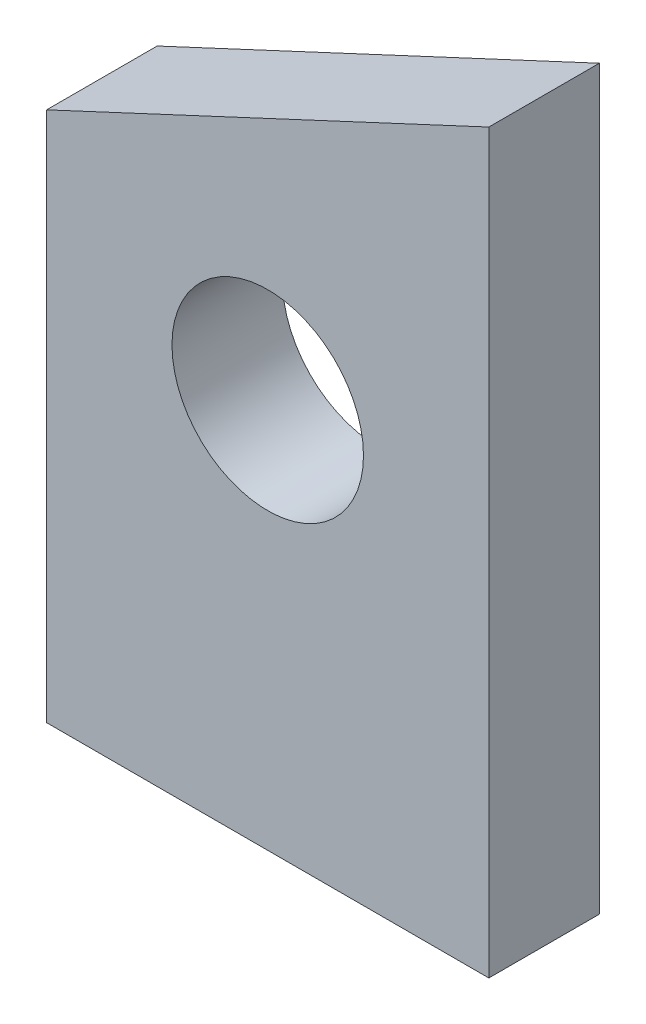
ISO-10303-21;
HEADER;
FILE_DESCRIPTION(('STEP AP214'),'2;1');
FILE_NAME('part.step','',(''),(''),'','','');
FILE_SCHEMA(('AUTOMOTIVE_DESIGN { 1 0 10303 214 1 1 1 1 }'));
ENDSEC;
DATA;
#1=APPLICATION_CONTEXT('core data for automotive mechanical design processes');
#2=APPLICATION_PROTOCOL_DEFINITION('international standard','automotive_design',2000,#1);
#3=PRODUCT_CONTEXT('',#1,'mechanical');
#4=PRODUCT('Part','Part','',(#3));
#5=PRODUCT_RELATED_PRODUCT_CATEGORY('part','',(#4));
#6=PRODUCT_DEFINITION_FORMATION('','',#4);
#7=PRODUCT_DEFINITION_CONTEXT('part definition',#1,'design');
#8=PRODUCT_DEFINITION('design','',#6,#7);
#9=PRODUCT_DEFINITION_SHAPE('','',#8);
#10=(LENGTH_UNIT() NAMED_UNIT(*) SI_UNIT(.MILLI.,.METRE.));
#11=(NAMED_UNIT(*) PLANE_ANGLE_UNIT() SI_UNIT($,.RADIAN.));
#12=(NAMED_UNIT(*) SI_UNIT($,.STERADIAN.) SOLID_ANGLE_UNIT());
#13=UNCERTAINTY_MEASURE_WITH_UNIT(LENGTH_MEASURE(1.E-05),#10,'distance_accuracy_value','');
#14=(GEOMETRIC_REPRESENTATION_CONTEXT(3) GLOBAL_UNCERTAINTY_ASSIGNED_CONTEXT((#13)) GLOBAL_UNIT_ASSIGNED_CONTEXT((#10,
#11,#12)) REPRESENTATION_CONTEXT('',''));
#15=CARTESIAN_POINT('',(0.,0.,0.));
#16=DIRECTION('',(0.,0.,1.));
#17=DIRECTION('',(1.,0.,0.));
#18=AXIS2_PLACEMENT_3D('',#15,#16,#17);
#19=CARTESIAN_POINT('',(0.,63.5,0.));
#20=DIRECTION('',(1.,0.,0.));
#21=DIRECTION('',(0.,0.,-1.));
#22=AXIS2_PLACEMENT_3D('',#19,#20,#21);
#23=PLANE('',#22);
#24=DIRECTION('',(0.,0.,1.));
#25=VECTOR('',#24,1.);
#26=CARTESIAN_POINT('',(0.,15.2426573283484,-0.00100000000000013));
#27=LINE('',#26,#25);
#28=CARTESIAN_POINT('',(0.,15.2426573283484,0.));
#29=VERTEX_POINT('',#28);
#30=CARTESIAN_POINT('',(0.,15.2426573283484,3.175));
#31=VERTEX_POINT('',#30);
#32=EDGE_CURVE('E81',#29,#31,#27,.T.);
#33=ORIENTED_EDGE('',*,*,#32,.F.);
#34=DIRECTION('',(0.,-1.,0.));
#35=VECTOR('',#34,1.);
#36=CARTESIAN_POINT('',(0.,63.5,0.));
#37=LINE('',#36,#35);
#38=CARTESIAN_POINT('',(0.,0.,0.));
#39=VERTEX_POINT('',#38);
#40=EDGE_CURVE('E65',#29,#39,#37,.T.);
#41=ORIENTED_EDGE('',*,*,#40,.T.);
#42=DIRECTION('',(0.,0.,1.));
#43=VECTOR('',#42,1.);
#44=CARTESIAN_POINT('',(0.,0.,0.));
#45=LINE('',#44,#43);
#46=CARTESIAN_POINT('',(0.,0.,3.175));
#47=VERTEX_POINT('',#46);
#48=EDGE_CURVE('E96',#39,#47,#45,.T.);
#49=ORIENTED_EDGE('',*,*,#48,.T.);
#50=DIRECTION('',(0.,-1.,0.));
#51=VECTOR('',#50,1.);
#52=CARTESIAN_POINT('',(0.,63.5,3.175));
#53=LINE('',#52,#51);
#54=EDGE_CURVE('E11',#31,#47,#53,.T.);
#55=ORIENTED_EDGE('',*,*,#54,.F.);
#56=EDGE_LOOP('',(#33,#41,#49,#55));
#57=FACE_BOUND('',#56,.T.);
#58=ADVANCED_FACE('F43',(#57),#23,.F.);
#59=CARTESIAN_POINT('',(0.,63.5,3.175));
#60=DIRECTION('',(0.,0.,-1.));
#61=DIRECTION('',(-1.,0.,0.));
#62=AXIS2_PLACEMENT_3D('',#59,#60,#61);
#63=PLANE('',#62);
#64=DIRECTION('',(-0.906307787036648,-0.422618261740704,0.));
#65=VECTOR('',#64,1.);
#66=CARTESIAN_POINT('',(12.7,21.1647645869169,3.175));
#67=LINE('',#66,#65);
#68=CARTESIAN_POINT('',(12.7,21.1647645869169,3.175));
#69=VERTEX_POINT('',#68);
#70=EDGE_CURVE('E84',#69,#31,#67,.T.);
#71=ORIENTED_EDGE('',*,*,#70,.T.);
#72=ORIENTED_EDGE('',*,*,#54,.T.);
#73=DIRECTION('',(1.,0.,0.));
#74=VECTOR('',#73,1.);
#75=CARTESIAN_POINT('',(0.,0.,3.175));
#76=LINE('',#75,#74);
#77=CARTESIAN_POINT('',(12.7,0.,3.175));
#78=VERTEX_POINT('',#77);
#79=EDGE_CURVE('E99',#47,#78,#76,.T.);
#80=ORIENTED_EDGE('',*,*,#79,.T.);
#81=DIRECTION('',(0.,-1.,0.));
#82=VECTOR('',#81,1.);
#83=CARTESIAN_POINT('',(12.7,63.5,3.175));
#84=LINE('',#83,#82);
#85=EDGE_CURVE('E50',#69,#78,#84,.T.);
#86=ORIENTED_EDGE('',*,*,#85,.F.);
#87=EDGE_LOOP('',(#71,#72,#80,#86));
#88=FACE_BOUND('',#87,.T.);
#89=CARTESIAN_POINT('',(6.35,11.1972611722229,3.175));
#90=DIRECTION('',(0.,0.,-1.));
#91=DIRECTION('',(-1.,0.,0.));
#92=AXIS2_PLACEMENT_3D('',#89,#90,#91);
#93=CIRCLE('',#92,2.75);
#94=CARTESIAN_POINT('',(3.6,11.1972611722229,3.175));
#95=VERTEX_POINT('',#94);
#96=EDGE_CURVE('E100',#95,#95,#93,.T.);
#97=ORIENTED_EDGE('',*,*,#96,.T.);
#98=EDGE_LOOP('',(#97));
#99=FACE_BOUND('',#98,.T.);
#100=ADVANCED_FACE('F90',(#88,#99),#63,.F.);
#101=CARTESIAN_POINT('',(12.7,63.5,0.));
#102=DIRECTION('',(-1.,0.,0.));
#103=DIRECTION('',(0.,0.,1.));
#104=AXIS2_PLACEMENT_3D('',#101,#102,#103);
#105=PLANE('',#104);
#106=DIRECTION('',(0.,0.,1.));
#107=VECTOR('',#106,1.);
#108=CARTESIAN_POINT('',(12.7,21.1647645869169,-0.00100000000000013));
#109=LINE('',#108,#107);
#110=CARTESIAN_POINT('',(12.7,21.1647645869169,0.));
#111=VERTEX_POINT('',#110);
#112=EDGE_CURVE('E57',#111,#69,#109,.T.);
#113=ORIENTED_EDGE('',*,*,#112,.T.);
#114=ORIENTED_EDGE('',*,*,#85,.T.);
#115=DIRECTION('',(0.,0.,-1.));
#116=VECTOR('',#115,1.);
#117=CARTESIAN_POINT('',(12.7,0.,0.));
#118=LINE('',#117,#116);
#119=CARTESIAN_POINT('',(12.7,0.,0.));
#120=VERTEX_POINT('',#119);
#121=EDGE_CURVE('E102',#78,#120,#118,.T.);
#122=ORIENTED_EDGE('',*,*,#121,.T.);
#123=DIRECTION('',(0.,-1.,0.));
#124=VECTOR('',#123,1.);
#125=CARTESIAN_POINT('',(12.7,63.5,0.));
#126=LINE('',#125,#124);
#127=EDGE_CURVE('E114',#111,#120,#126,.T.);
#128=ORIENTED_EDGE('',*,*,#127,.F.);
#129=EDGE_LOOP('',(#113,#114,#122,#128));
#130=FACE_BOUND('',#129,.T.);
#131=ADVANCED_FACE('F116',(#130),#105,.F.);
#132=CARTESIAN_POINT('',(0.,63.5,0.));
#133=DIRECTION('',(0.,0.,1.));
#134=DIRECTION('',(1.,0.,0.));
#135=AXIS2_PLACEMENT_3D('',#132,#133,#134);
#136=PLANE('',#135);
#137=DIRECTION('',(0.906307787036648,0.422618261740704,0.));
#138=VECTOR('',#137,1.);
#139=CARTESIAN_POINT('',(12.7,21.1647645869169,0.));
#140=LINE('',#139,#138);
#141=EDGE_CURVE('E85',#29,#111,#140,.T.);
#142=ORIENTED_EDGE('',*,*,#141,.T.);
#143=ORIENTED_EDGE('',*,*,#127,.T.);
#144=DIRECTION('',(-1.,0.,0.));
#145=VECTOR('',#144,1.);
#146=CARTESIAN_POINT('',(0.,0.,0.));
#147=LINE('',#146,#145);
#148=EDGE_CURVE('E111',#120,#39,#147,.T.);
#149=ORIENTED_EDGE('',*,*,#148,.T.);
#150=ORIENTED_EDGE('',*,*,#40,.F.);
#151=EDGE_LOOP('',(#142,#143,#149,#150));
#152=FACE_BOUND('',#151,.T.);
#153=CARTESIAN_POINT('',(6.35,11.1972611722229,0.));
#154=DIRECTION('',(0.,0.,1.));
#155=DIRECTION('',(1.,0.,0.));
#156=AXIS2_PLACEMENT_3D('',#153,#154,#155);
#157=CIRCLE('',#156,2.75);
#158=CARTESIAN_POINT('',(9.1,11.1972611722229,0.));
#159=VERTEX_POINT('',#158);
#160=EDGE_CURVE('E105',#159,#159,#157,.T.);
#161=ORIENTED_EDGE('',*,*,#160,.T.);
#162=EDGE_LOOP('',(#161));
#163=FACE_BOUND('',#162,.T.);
#164=ADVANCED_FACE('F121',(#152,#163),#136,.F.);
#165=CARTESIAN_POINT('',(0.,0.,0.));
#166=DIRECTION('',(0.,1.,0.));
#167=DIRECTION('',(0.,0.,1.));
#168=AXIS2_PLACEMENT_3D('',#165,#166,#167);
#169=PLANE('',#168);
#170=ORIENTED_EDGE('',*,*,#48,.F.);
#171=ORIENTED_EDGE('',*,*,#148,.F.);
#172=ORIENTED_EDGE('',*,*,#121,.F.);
#173=ORIENTED_EDGE('',*,*,#79,.F.);
#174=EDGE_LOOP('',(#170,#171,#172,#173));
#175=FACE_BOUND('',#174,.T.);
#176=ADVANCED_FACE('F119',(#175),#169,.F.);
#177=CARTESIAN_POINT('',(12.7,21.1647645869169,-0.00100000000000013));
#178=DIRECTION('',(-0.422618261740704,0.906307787036648,0.));
#179=DIRECTION('',(-0.906307787036648,-0.422618261740704,0.));
#180=AXIS2_PLACEMENT_3D('',#177,#178,#179);
#181=PLANE('',#180);
#182=ORIENTED_EDGE('',*,*,#32,.T.);
#183=ORIENTED_EDGE('',*,*,#70,.F.);
#184=ORIENTED_EDGE('',*,*,#112,.F.);
#185=ORIENTED_EDGE('',*,*,#141,.F.);
#186=EDGE_LOOP('',(#182,#183,#184,#185));
#187=FACE_BOUND('',#186,.T.);
#188=ADVANCED_FACE('F83',(#187),#181,.T.);
#189=CARTESIAN_POINT('',(6.35,11.1972611722229,-0.00100000000000013));
#190=DIRECTION('',(0.,0.,1.));
#191=DIRECTION('',(1.,0.,0.));
#192=AXIS2_PLACEMENT_3D('',#189,#190,#191);
#193=CYLINDRICAL_SURFACE('',#192,2.75);
#194=ORIENTED_EDGE('',*,*,#96,.F.);
#195=EDGE_LOOP('',(#194));
#196=FACE_BOUND('',#195,.T.);
#197=ORIENTED_EDGE('',*,*,#160,.F.);
#198=EDGE_LOOP('',(#197));
#199=FACE_BOUND('',#198,.T.);
#200=ADVANCED_FACE('F128',(#196,#199),#193,.F.);
#201=CLOSED_SHELL('',(#58,#100,#131,#164,#176,#188,#200));
#202=MANIFOLD_SOLID_BREP('B2',#201);
#203=ADVANCED_BREP_SHAPE_REPRESENTATION('',(#18,#202),#14);
#204=SHAPE_DEFINITION_REPRESENTATION(#9,#203);
ENDSEC;
END-ISO-10303-21;
